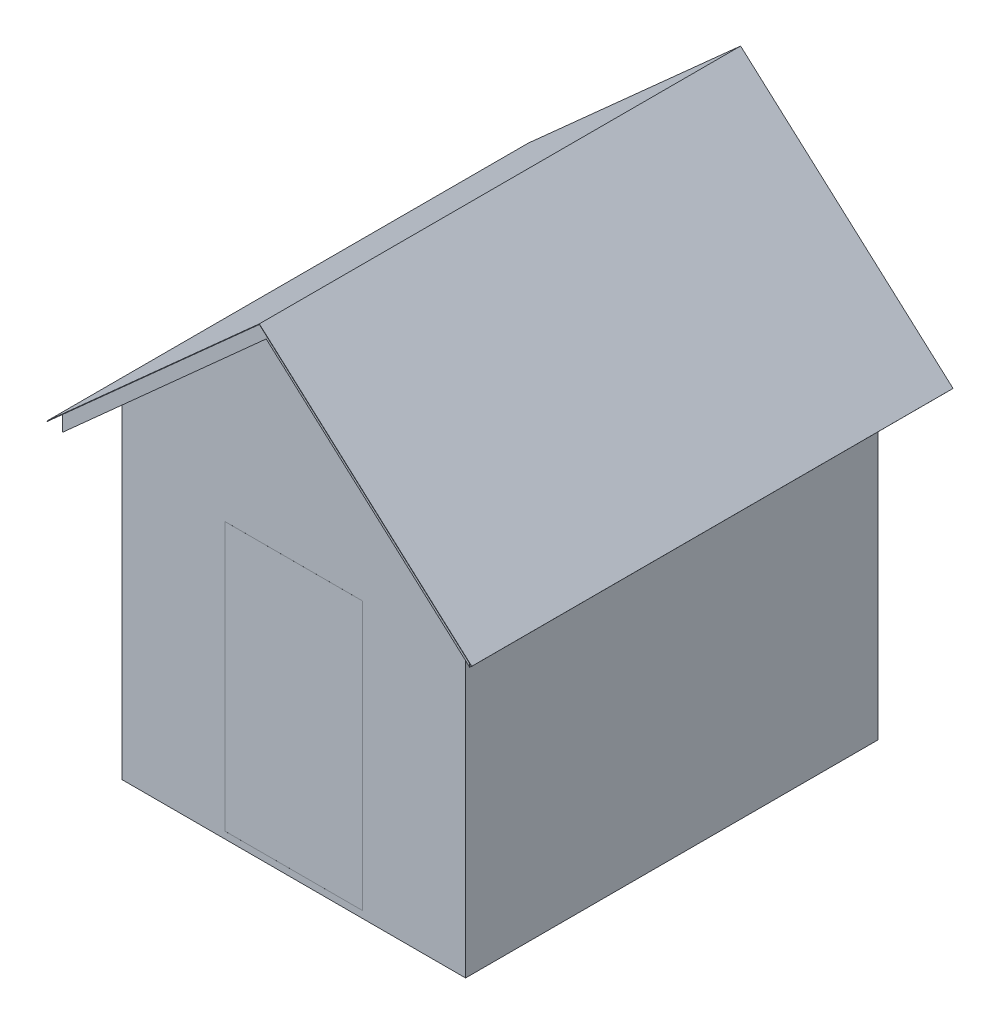
ISO-10303-21;
HEADER;
FILE_DESCRIPTION(('STEP AP214'),'2;1');
FILE_NAME('part.step','',(''),(''),'','','');
FILE_SCHEMA(('AUTOMOTIVE_DESIGN { 1 0 10303 214 1 1 1 1 }'));
ENDSEC;
DATA;
#1=APPLICATION_CONTEXT('core data for automotive mechanical design processes');
#2=APPLICATION_PROTOCOL_DEFINITION('international standard','automotive_design',2000,#1);
#3=PRODUCT_CONTEXT('',#1,'mechanical');
#4=PRODUCT('Part','Part','',(#3));
#5=PRODUCT_RELATED_PRODUCT_CATEGORY('part','',(#4));
#6=PRODUCT_DEFINITION_FORMATION('','',#4);
#7=PRODUCT_DEFINITION_CONTEXT('part definition',#1,'design');
#8=PRODUCT_DEFINITION('design','',#6,#7);
#9=PRODUCT_DEFINITION_SHAPE('','',#8);
#10=(LENGTH_UNIT() NAMED_UNIT(*) SI_UNIT(.MILLI.,.METRE.));
#11=(NAMED_UNIT(*) PLANE_ANGLE_UNIT() SI_UNIT($,.RADIAN.));
#12=(NAMED_UNIT(*) SI_UNIT($,.STERADIAN.) SOLID_ANGLE_UNIT());
#13=UNCERTAINTY_MEASURE_WITH_UNIT(LENGTH_MEASURE(1.E-05),#10,'distance_accuracy_value','');
#14=(GEOMETRIC_REPRESENTATION_CONTEXT(3) GLOBAL_UNCERTAINTY_ASSIGNED_CONTEXT((#13)) GLOBAL_UNIT_ASSIGNED_CONTEXT((#10,
#11,#12)) REPRESENTATION_CONTEXT('',''));
#15=CARTESIAN_POINT('',(0.,0.,0.));
#16=DIRECTION('',(0.,0.,1.));
#17=DIRECTION('',(1.,0.,0.));
#18=AXIS2_PLACEMENT_3D('',#15,#16,#17);
#19=CARTESIAN_POINT('',(-2.00160900286555,3617.74771430914,-1750.));
#20=DIRECTION('',(-0.667203000955183,-0.744875932968973,0.));
#21=DIRECTION('',(0.744875932968973,-0.667203000955183,0.));
#22=AXIS2_PLACEMENT_3D('',#19,#20,#21);
#23=PLANE('',#22);
#24=DIRECTION('',(0.,0.,1.));
#25=VECTOR('',#24,1.);
#26=CARTESIAN_POINT('',(1543.19094316951,2233.68217771199,-1750.));
#27=LINE('',#26,#25);
#28=CARTESIAN_POINT('',(1543.19094316951,2233.68217771199,-1750.));
#29=VERTEX_POINT('',#28);
#30=CARTESIAN_POINT('',(1543.19094316951,2233.68217771199,1750.));
#31=VERTEX_POINT('',#30);
#32=EDGE_CURVE('E59',#29,#31,#27,.T.);
#33=ORIENTED_EDGE('',*,*,#32,.T.);
#34=DIRECTION('',(0.744875932968973,-0.667203000955183,0.));
#35=VECTOR('',#34,1.);
#36=CARTESIAN_POINT('',(-2.00160900286555,3617.74771430914,1750.));
#37=LINE('',#36,#35);
#38=CARTESIAN_POINT('',(0.000422445786859389,3615.95444736169,1750.));
#39=VERTEX_POINT('',#38);
#40=EDGE_CURVE('E108',#39,#31,#37,.T.);
#41=ORIENTED_EDGE('',*,*,#40,.F.);
#42=DIRECTION('',(0.,0.,1.));
#43=VECTOR('',#42,1.);
#44=CARTESIAN_POINT('',(0.000422445786859389,3615.95444736169,-1750.));
#45=LINE('',#44,#43);
#46=CARTESIAN_POINT('',(0.000422445786859389,3615.95444736169,-1750.));
#47=VERTEX_POINT('',#46);
#48=EDGE_CURVE('E12',#47,#39,#45,.T.);
#49=ORIENTED_EDGE('',*,*,#48,.F.);
#50=DIRECTION('',(0.744875932968973,-0.667203000955183,0.));
#51=VECTOR('',#50,1.);
#52=CARTESIAN_POINT('',(-2.00160900286555,3617.74771430914,-1750.));
#53=LINE('',#52,#51);
#54=EDGE_CURVE('E109',#47,#29,#53,.T.);
#55=ORIENTED_EDGE('',*,*,#54,.T.);
#56=EDGE_LOOP('',(#33,#41,#49,#55));
#57=FACE_BOUND('',#56,.T.);
#58=ADVANCED_FACE('F56',(#57),#23,.T.);
#59=CARTESIAN_POINT('',(-1542.53845307509,2233.68259761883,-1750.));
#60=DIRECTION('',(0.667359231519582,-0.744735964020533,0.));
#61=DIRECTION('',(0.744735964020533,0.667359231519582,0.));
#62=AXIS2_PLACEMENT_3D('',#59,#60,#61);
#63=PLANE('',#62);
#64=ORIENTED_EDGE('',*,*,#48,.T.);
#65=DIRECTION('',(0.744735964020533,0.667359231519582,0.));
#66=VECTOR('',#65,1.);
#67=CARTESIAN_POINT('',(-1542.53845307509,2233.68259761883,1750.));
#68=LINE('',#67,#66);
#69=CARTESIAN_POINT('',(-1542.53845307509,2233.68259761883,1750.));
#70=VERTEX_POINT('',#69);
#71=EDGE_CURVE('E123',#70,#39,#68,.T.);
#72=ORIENTED_EDGE('',*,*,#71,.F.);
#73=DIRECTION('',(0.,0.,1.));
#74=VECTOR('',#73,1.);
#75=CARTESIAN_POINT('',(-1542.53845307509,2233.68259761883,-1750.));
#76=LINE('',#75,#74);
#77=CARTESIAN_POINT('',(-1542.53845307509,2233.68259761883,-1750.));
#78=VERTEX_POINT('',#77);
#79=EDGE_CURVE('E64',#78,#70,#76,.T.);
#80=ORIENTED_EDGE('',*,*,#79,.F.);
#81=DIRECTION('',(0.744735964020533,0.667359231519582,0.));
#82=VECTOR('',#81,1.);
#83=CARTESIAN_POINT('',(-1542.53845307509,2233.68259761883,-1750.));
#84=LINE('',#83,#82);
#85=EDGE_CURVE('E114',#78,#47,#84,.T.);
#86=ORIENTED_EDGE('',*,*,#85,.T.);
#87=EDGE_LOOP('',(#64,#72,#80,#86));
#88=FACE_BOUND('',#87,.T.);
#89=ADVANCED_FACE('F164',(#88),#63,.T.);
#90=CARTESIAN_POINT('',(-1542.53845307509,2233.68259761883,-1750.));
#91=DIRECTION('',(0.744735964020489,0.667359231519631,0.));
#92=DIRECTION('',(-0.667359231519631,0.744735964020489,0.));
#93=AXIS2_PLACEMENT_3D('',#90,#91,#92);
#94=PLANE('',#93);
#95=ORIENTED_EDGE('',*,*,#79,.T.);
#96=DIRECTION('',(-0.667359231519631,0.744735964020489,0.));
#97=VECTOR('',#96,1.);
#98=CARTESIAN_POINT('',(-1542.53845307509,2233.68259761883,1750.));
#99=LINE('',#98,#97);
#100=CARTESIAN_POINT('',(-1544.54053076965,2235.91680551089,1750.));
#101=VERTEX_POINT('',#100);
#102=EDGE_CURVE('E134',#70,#101,#99,.T.);
#103=ORIENTED_EDGE('',*,*,#102,.T.);
#104=DIRECTION('',(0.,0.,1.));
#105=VECTOR('',#104,1.);
#106=CARTESIAN_POINT('',(-1544.54053076965,2235.91680551089,-1750.));
#107=LINE('',#106,#105);
#108=CARTESIAN_POINT('',(-1544.54053076965,2235.91680551089,-1750.));
#109=VERTEX_POINT('',#108);
#110=EDGE_CURVE('E149',#109,#101,#107,.T.);
#111=ORIENTED_EDGE('',*,*,#110,.F.);
#112=DIRECTION('',(-0.667359231519631,0.744735964020489,0.));
#113=VECTOR('',#112,1.);
#114=CARTESIAN_POINT('',(-1542.53845307509,2233.68259761883,-1750.));
#115=LINE('',#114,#113);
#116=EDGE_CURVE('E145',#78,#109,#115,.T.);
#117=ORIENTED_EDGE('',*,*,#116,.F.);
#118=EDGE_LOOP('',(#95,#103,#111,#117));
#119=FACE_BOUND('',#118,.T.);
#120=ADVANCED_FACE('F162',(#119),#94,.F.);
#121=CARTESIAN_POINT('',(-1544.54053076965,2235.91680551089,-1750.));
#122=DIRECTION('',(0.667359231519582,-0.744735964020533,0.));
#123=DIRECTION('',(0.744735964020533,0.667359231519582,0.));
#124=AXIS2_PLACEMENT_3D('',#121,#122,#123);
#125=PLANE('',#124);
#126=ORIENTED_EDGE('',*,*,#110,.T.);
#127=DIRECTION('',(0.744735964020533,0.667359231519582,0.));
#128=VECTOR('',#127,1.);
#129=CARTESIAN_POINT('',(-1544.54053076965,2235.91680551089,1750.));
#130=LINE('',#129,#128);
#131=CARTESIAN_POINT('',(0.,3619.98234210805,1750.));
#132=VERTEX_POINT('',#131);
#133=EDGE_CURVE('E129',#101,#132,#130,.T.);
#134=ORIENTED_EDGE('',*,*,#133,.T.);
#135=DIRECTION('',(0.,0.,1.));
#136=VECTOR('',#135,1.);
#137=CARTESIAN_POINT('',(0.,3619.98234210805,-1750.));
#138=LINE('',#137,#136);
#139=CARTESIAN_POINT('',(0.,3619.98234210805,-1750.));
#140=VERTEX_POINT('',#139);
#141=EDGE_CURVE('E151',#140,#132,#138,.T.);
#142=ORIENTED_EDGE('',*,*,#141,.F.);
#143=DIRECTION('',(0.744735964020533,0.667359231519582,0.));
#144=VECTOR('',#143,1.);
#145=CARTESIAN_POINT('',(-1544.54053076965,2235.91680551089,-1750.));
#146=LINE('',#145,#144);
#147=EDGE_CURVE('E143',#109,#140,#146,.T.);
#148=ORIENTED_EDGE('',*,*,#147,.F.);
#149=EDGE_LOOP('',(#126,#134,#142,#148));
#150=FACE_BOUND('',#149,.T.);
#151=ADVANCED_FACE('F159',(#150),#125,.F.);
#152=CARTESIAN_POINT('',(0.,3619.98234210805,-1750.));
#153=DIRECTION('',(-0.667203000955183,-0.744875932968973,0.));
#154=DIRECTION('',(0.744875932968973,-0.667203000955183,0.));
#155=AXIS2_PLACEMENT_3D('',#152,#153,#154);
#156=PLANE('',#155);
#157=ORIENTED_EDGE('',*,*,#141,.T.);
#158=DIRECTION('',(0.744875932968973,-0.667203000955183,0.));
#159=VECTOR('',#158,1.);
#160=CARTESIAN_POINT('',(0.,3619.98234210805,1750.));
#161=LINE('',#160,#159);
#162=CARTESIAN_POINT('',(1545.19255217238,2235.91680551089,1750.));
#163=VERTEX_POINT('',#162);
#164=EDGE_CURVE('E127',#132,#163,#161,.T.);
#165=ORIENTED_EDGE('',*,*,#164,.T.);
#166=DIRECTION('',(0.,0.,1.));
#167=VECTOR('',#166,1.);
#168=CARTESIAN_POINT('',(1545.19255217238,2235.91680551089,-1750.));
#169=LINE('',#168,#167);
#170=CARTESIAN_POINT('',(1545.19255217238,2235.91680551089,-1750.));
#171=VERTEX_POINT('',#170);
#172=EDGE_CURVE('E113',#171,#163,#169,.T.);
#173=ORIENTED_EDGE('',*,*,#172,.F.);
#174=DIRECTION('',(0.744875932968973,-0.667203000955183,0.));
#175=VECTOR('',#174,1.);
#176=CARTESIAN_POINT('',(0.,3619.98234210805,-1750.));
#177=LINE('',#176,#175);
#178=EDGE_CURVE('E141',#140,#171,#177,.T.);
#179=ORIENTED_EDGE('',*,*,#178,.F.);
#180=EDGE_LOOP('',(#157,#165,#173,#179));
#181=FACE_BOUND('',#180,.T.);
#182=ADVANCED_FACE('F155',(#181),#156,.F.);
#183=CARTESIAN_POINT('',(1545.19255217238,2235.91680551089,-1750.));
#184=DIRECTION('',(-0.744875932968931,0.66720300095523,0.));
#185=DIRECTION('',(-0.66720300095523,-0.744875932968931,0.));
#186=AXIS2_PLACEMENT_3D('',#183,#184,#185);
#187=PLANE('',#186);
#188=ORIENTED_EDGE('',*,*,#172,.T.);
#189=DIRECTION('',(-0.66720300095523,-0.744875932968931,0.));
#190=VECTOR('',#189,1.);
#191=CARTESIAN_POINT('',(1545.19255217238,2235.91680551089,1750.));
#192=LINE('',#191,#190);
#193=EDGE_CURVE('E120',#163,#31,#192,.T.);
#194=ORIENTED_EDGE('',*,*,#193,.T.);
#195=ORIENTED_EDGE('',*,*,#32,.F.);
#196=DIRECTION('',(-0.66720300095523,-0.744875932968931,0.));
#197=VECTOR('',#196,1.);
#198=CARTESIAN_POINT('',(1545.19255217238,2235.91680551089,-1750.));
#199=LINE('',#198,#197);
#200=EDGE_CURVE('E139',#171,#29,#199,.T.);
#201=ORIENTED_EDGE('',*,*,#200,.F.);
#202=EDGE_LOOP('',(#188,#194,#195,#201));
#203=FACE_BOUND('',#202,.T.);
#204=ADVANCED_FACE('F125',(#203),#187,.F.);
#205=CARTESIAN_POINT('',(0.,0.,-1750.));
#206=DIRECTION('',(0.,0.,-1.));
#207=DIRECTION('',(-1.,0.,0.));
#208=AXIS2_PLACEMENT_3D('',#205,#206,#207);
#209=PLANE('',#208);
#210=ORIENTED_EDGE('',*,*,#54,.F.);
#211=ORIENTED_EDGE('',*,*,#85,.F.);
#212=ORIENTED_EDGE('',*,*,#116,.T.);
#213=ORIENTED_EDGE('',*,*,#147,.T.);
#214=ORIENTED_EDGE('',*,*,#178,.T.);
#215=ORIENTED_EDGE('',*,*,#200,.T.);
#216=EDGE_LOOP('',(#210,#211,#212,#213,#214,#215));
#217=FACE_BOUND('',#216,.T.);
#218=ADVANCED_FACE('F166',(#217),#209,.T.);
#219=CARTESIAN_POINT('',(0.,0.,1750.));
#220=DIRECTION('',(0.,0.,-1.));
#221=DIRECTION('',(-1.,0.,0.));
#222=AXIS2_PLACEMENT_3D('',#219,#220,#221);
#223=PLANE('',#222);
#224=ORIENTED_EDGE('',*,*,#40,.T.);
#225=ORIENTED_EDGE('',*,*,#193,.F.);
#226=ORIENTED_EDGE('',*,*,#164,.F.);
#227=ORIENTED_EDGE('',*,*,#133,.F.);
#228=ORIENTED_EDGE('',*,*,#102,.F.);
#229=ORIENTED_EDGE('',*,*,#71,.T.);
#230=EDGE_LOOP('',(#224,#225,#226,#227,#228,#229));
#231=FACE_BOUND('',#230,.T.);
#232=ADVANCED_FACE('F118',(#231),#223,.F.);
#233=CLOSED_SHELL('',(#58,#89,#120,#151,#182,#204,#218,#232));
#234=MANIFOLD_SOLID_BREP('B2',#233);
#235=CARTESIAN_POINT('',(-4.66293670342566E-12,3500.,1700.));
#236=DIRECTION('',(0.667776317014636,-0.744362002277365,0.));
#237=DIRECTION('',(0.744362002277365,0.667776317014636,0.));
#238=AXIS2_PLACEMENT_3D('',#235,#236,#237);
#239=PLANE('',#238);
#240=DIRECTION('',(0.,0.,-1.));
#241=VECTOR('',#240,1.);
#242=CARTESIAN_POINT('',(-1480.23127503153,2172.06629819061,1700.));
#243=LINE('',#242,#241);
#244=CARTESIAN_POINT('',(-1480.23127503153,2172.06629819061,1700.));
#245=VERTEX_POINT('',#244);
#246=CARTESIAN_POINT('',(-1480.23127503153,2172.06629819061,-1700.));
#247=VERTEX_POINT('',#246);
#248=EDGE_CURVE('E261',#245,#247,#243,.T.);
#249=ORIENTED_EDGE('',*,*,#248,.T.);
#250=DIRECTION('',(-0.744362002277365,-0.667776317014636,0.));
#251=VECTOR('',#250,1.);
#252=CARTESIAN_POINT('',(-4.66293670342566E-12,3500.,-1700.));
#253=LINE('',#252,#251);
#254=CARTESIAN_POINT('',(-4.66293670342566E-12,3500.,-1700.));
#255=VERTEX_POINT('',#254);
#256=EDGE_CURVE('E310',#255,#247,#253,.T.);
#257=ORIENTED_EDGE('',*,*,#256,.F.);
#258=DIRECTION('',(0.,0.,-1.));
#259=VECTOR('',#258,1.);
#260=CARTESIAN_POINT('',(-4.66293670342566E-12,3500.,1700.));
#261=LINE('',#260,#259);
#262=CARTESIAN_POINT('',(-4.66293670342566E-12,3500.,1700.));
#263=VERTEX_POINT('',#262);
#264=EDGE_CURVE('E54',#263,#255,#261,.T.);
#265=ORIENTED_EDGE('',*,*,#264,.F.);
#266=DIRECTION('',(-0.744362002277365,-0.667776317014636,0.));
#267=VECTOR('',#266,1.);
#268=CARTESIAN_POINT('',(-4.66293670342566E-12,3500.,1700.));
#269=LINE('',#268,#267);
#270=EDGE_CURVE('E311',#263,#245,#269,.T.);
#271=ORIENTED_EDGE('',*,*,#270,.T.);
#272=EDGE_LOOP('',(#249,#257,#265,#271));
#273=FACE_BOUND('',#272,.T.);
#274=ADVANCED_FACE('F258',(#273),#239,.T.);
#275=CARTESIAN_POINT('',(-4.66293670342566E-12,3500.,1700.));
#276=DIRECTION('',(-0.667776317014634,-0.744362002277367,0.));
#277=DIRECTION('',(0.744362002277367,-0.667776317014634,0.));
#278=AXIS2_PLACEMENT_3D('',#275,#276,#277);
#279=PLANE('',#278);
#280=ORIENTED_EDGE('',*,*,#264,.T.);
#281=DIRECTION('',(-0.744362002277367,0.667776317014634,0.));
#282=VECTOR('',#281,1.);
#283=CARTESIAN_POINT('',(-4.66293670342566E-12,3500.,-1700.));
#284=LINE('',#283,#282);
#285=CARTESIAN_POINT('',(1480.23127503153,2172.06629819061,-1700.));
#286=VERTEX_POINT('',#285);
#287=EDGE_CURVE('E328',#286,#255,#284,.T.);
#288=ORIENTED_EDGE('',*,*,#287,.F.);
#289=DIRECTION('',(0.,0.,-1.));
#290=VECTOR('',#289,1.);
#291=CARTESIAN_POINT('',(1480.23127503153,2172.06629819061,1700.));
#292=LINE('',#291,#290);
#293=CARTESIAN_POINT('',(1480.23127503153,2172.06629819061,1700.));
#294=VERTEX_POINT('',#293);
#295=EDGE_CURVE('E266',#294,#286,#292,.T.);
#296=ORIENTED_EDGE('',*,*,#295,.F.);
#297=DIRECTION('',(-0.744362002277367,0.667776317014634,0.));
#298=VECTOR('',#297,1.);
#299=CARTESIAN_POINT('',(-4.66293670342566E-12,3500.,1700.));
#300=LINE('',#299,#298);
#301=EDGE_CURVE('E316',#294,#263,#300,.T.);
#302=ORIENTED_EDGE('',*,*,#301,.T.);
#303=EDGE_LOOP('',(#280,#288,#296,#302));
#304=FACE_BOUND('',#303,.T.);
#305=ADVANCED_FACE('F368',(#304),#279,.T.);
#306=CARTESIAN_POINT('',(1480.23127503153,2172.06629819061,1700.));
#307=DIRECTION('',(1.,0.,0.));
#308=DIRECTION('',(0.,0.,-1.));
#309=AXIS2_PLACEMENT_3D('',#306,#307,#308);
#310=PLANE('',#309);
#311=ORIENTED_EDGE('',*,*,#295,.T.);
#312=DIRECTION('',(0.,-1.,0.));
#313=VECTOR('',#312,1.);
#314=CARTESIAN_POINT('',(1480.23127503153,2172.06629819061,-1700.));
#315=LINE('',#314,#313);
#316=CARTESIAN_POINT('',(1480.23127503153,2292.04864029866,-1700.));
#317=VERTEX_POINT('',#316);
#318=EDGE_CURVE('E335',#317,#286,#315,.T.);
#319=ORIENTED_EDGE('',*,*,#318,.F.);
#320=DIRECTION('',(0.,0.,-1.));
#321=VECTOR('',#320,1.);
#322=CARTESIAN_POINT('',(1480.23127503153,2292.04864029866,1700.));
#323=LINE('',#322,#321);
#324=CARTESIAN_POINT('',(1480.23127503153,2292.04864029866,1700.));
#325=VERTEX_POINT('',#324);
#326=EDGE_CURVE('E351',#325,#317,#323,.T.);
#327=ORIENTED_EDGE('',*,*,#326,.F.);
#328=DIRECTION('',(0.,-1.,0.));
#329=VECTOR('',#328,1.);
#330=CARTESIAN_POINT('',(1480.23127503153,2172.06629819061,1700.));
#331=LINE('',#330,#329);
#332=EDGE_CURVE('E347',#325,#294,#331,.T.);
#333=ORIENTED_EDGE('',*,*,#332,.T.);
#334=EDGE_LOOP('',(#311,#319,#327,#333));
#335=FACE_BOUND('',#334,.T.);
#336=ADVANCED_FACE('F364',(#335),#310,.T.);
#337=CARTESIAN_POINT('',(1480.23127503153,2292.04864029866,1700.));
#338=DIRECTION('',(0.667776317014634,0.744362002277367,0.));
#339=DIRECTION('',(-0.744362002277367,0.667776317014634,0.));
#340=AXIS2_PLACEMENT_3D('',#337,#338,#339);
#341=PLANE('',#340);
#342=ORIENTED_EDGE('',*,*,#326,.T.);
#343=DIRECTION('',(0.744362002277367,-0.667776317014634,0.));
#344=VECTOR('',#343,1.);
#345=CARTESIAN_POINT('',(1480.23127503153,2292.04864029866,-1700.));
#346=LINE('',#345,#344);
#347=CARTESIAN_POINT('',(0.,3619.98234210805,-1700.));
#348=VERTEX_POINT('',#347);
#349=EDGE_CURVE('E332',#348,#317,#346,.T.);
#350=ORIENTED_EDGE('',*,*,#349,.F.);
#351=DIRECTION('',(0.,0.,-1.));
#352=VECTOR('',#351,1.);
#353=CARTESIAN_POINT('',(0.,3619.98234210805,1700.));
#354=LINE('',#353,#352);
#355=CARTESIAN_POINT('',(0.,3619.98234210805,1700.));
#356=VERTEX_POINT('',#355);
#357=EDGE_CURVE('E353',#356,#348,#354,.T.);
#358=ORIENTED_EDGE('',*,*,#357,.F.);
#359=DIRECTION('',(0.744362002277367,-0.667776317014634,0.));
#360=VECTOR('',#359,1.);
#361=CARTESIAN_POINT('',(1480.23127503153,2292.04864029866,1700.));
#362=LINE('',#361,#360);
#363=EDGE_CURVE('E344',#356,#325,#362,.T.);
#364=ORIENTED_EDGE('',*,*,#363,.T.);
#365=EDGE_LOOP('',(#342,#350,#358,#364));
#366=FACE_BOUND('',#365,.T.);
#367=ADVANCED_FACE('F361',(#366),#341,.T.);
#368=CARTESIAN_POINT('',(-1480.23127503153,2292.04864029866,1700.));
#369=DIRECTION('',(-0.667776317014634,0.744362002277367,0.));
#370=DIRECTION('',(-0.744362002277367,-0.667776317014634,0.));
#371=AXIS2_PLACEMENT_3D('',#368,#369,#370);
#372=PLANE('',#371);
#373=ORIENTED_EDGE('',*,*,#357,.T.);
#374=DIRECTION('',(0.744362002277367,0.667776317014634,0.));
#375=VECTOR('',#374,1.);
#376=CARTESIAN_POINT('',(-1480.23127503153,2292.04864029866,-1700.));
#377=LINE('',#376,#375);
#378=CARTESIAN_POINT('',(-1480.23127503153,2292.04864029866,-1700.));
#379=VERTEX_POINT('',#378);
#380=EDGE_CURVE('E323',#379,#348,#377,.T.);
#381=ORIENTED_EDGE('',*,*,#380,.F.);
#382=DIRECTION('',(0.,0.,-1.));
#383=VECTOR('',#382,1.);
#384=CARTESIAN_POINT('',(-1480.23127503153,2292.04864029866,1700.));
#385=LINE('',#384,#383);
#386=CARTESIAN_POINT('',(-1480.23127503153,2292.04864029866,1700.));
#387=VERTEX_POINT('',#386);
#388=EDGE_CURVE('E315',#387,#379,#385,.T.);
#389=ORIENTED_EDGE('',*,*,#388,.F.);
#390=DIRECTION('',(0.744362002277367,0.667776317014634,0.));
#391=VECTOR('',#390,1.);
#392=CARTESIAN_POINT('',(-1480.23127503153,2292.04864029866,1700.));
#393=LINE('',#392,#391);
#394=EDGE_CURVE('E341',#387,#356,#393,.T.);
#395=ORIENTED_EDGE('',*,*,#394,.T.);
#396=EDGE_LOOP('',(#373,#381,#389,#395));
#397=FACE_BOUND('',#396,.T.);
#398=ADVANCED_FACE('F355',(#397),#372,.T.);
#399=CARTESIAN_POINT('',(-1480.23127503153,2172.06629819061,1700.));
#400=DIRECTION('',(-1.,0.,0.));
#401=DIRECTION('',(0.,0.,1.));
#402=AXIS2_PLACEMENT_3D('',#399,#400,#401);
#403=PLANE('',#402);
#404=ORIENTED_EDGE('',*,*,#388,.T.);
#405=DIRECTION('',(0.,1.,0.));
#406=VECTOR('',#405,1.);
#407=CARTESIAN_POINT('',(-1480.23127503153,2172.06629819061,-1700.));
#408=LINE('',#407,#406);
#409=EDGE_CURVE('E318',#247,#379,#408,.T.);
#410=ORIENTED_EDGE('',*,*,#409,.F.);
#411=ORIENTED_EDGE('',*,*,#248,.F.);
#412=DIRECTION('',(0.,1.,0.));
#413=VECTOR('',#412,1.);
#414=CARTESIAN_POINT('',(-1480.23127503153,2172.06629819061,1700.));
#415=LINE('',#414,#413);
#416=EDGE_CURVE('E339',#245,#387,#415,.T.);
#417=ORIENTED_EDGE('',*,*,#416,.T.);
#418=EDGE_LOOP('',(#404,#410,#411,#417));
#419=FACE_BOUND('',#418,.T.);
#420=ADVANCED_FACE('F319',(#419),#403,.T.);
#421=CARTESIAN_POINT('',(0.,0.,1700.));
#422=DIRECTION('',(0.,0.,-1.));
#423=DIRECTION('',(-1.,0.,0.));
#424=AXIS2_PLACEMENT_3D('',#421,#422,#423);
#425=PLANE('',#424);
#426=ORIENTED_EDGE('',*,*,#270,.F.);
#427=ORIENTED_EDGE('',*,*,#301,.F.);
#428=ORIENTED_EDGE('',*,*,#332,.F.);
#429=ORIENTED_EDGE('',*,*,#363,.F.);
#430=ORIENTED_EDGE('',*,*,#394,.F.);
#431=ORIENTED_EDGE('',*,*,#416,.F.);
#432=EDGE_LOOP('',(#426,#427,#428,#429,#430,#431));
#433=FACE_BOUND('',#432,.T.);
#434=ADVANCED_FACE('F367',(#433),#425,.F.);
#435=CARTESIAN_POINT('',(0.,0.,-1700.));
#436=DIRECTION('',(0.,0.,-1.));
#437=DIRECTION('',(-1.,0.,0.));
#438=AXIS2_PLACEMENT_3D('',#435,#436,#437);
#439=PLANE('',#438);
#440=ORIENTED_EDGE('',*,*,#256,.T.);
#441=ORIENTED_EDGE('',*,*,#409,.T.);
#442=ORIENTED_EDGE('',*,*,#380,.T.);
#443=ORIENTED_EDGE('',*,*,#349,.T.);
#444=ORIENTED_EDGE('',*,*,#318,.T.);
#445=ORIENTED_EDGE('',*,*,#287,.T.);
#446=EDGE_LOOP('',(#440,#441,#442,#443,#444,#445));
#447=FACE_BOUND('',#446,.T.);
#448=ADVANCED_FACE('F326',(#447),#439,.T.);
#449=CLOSED_SHELL('',(#274,#305,#336,#367,#398,#420,#434,#448));
#450=MANIFOLD_SOLID_BREP('B6',#449);
#451=CARTESIAN_POINT('',(-1250.,3500.,1400.));
#452=DIRECTION('',(0.,0.,-1.));
#453=DIRECTION('',(-1.,0.,0.));
#454=AXIS2_PLACEMENT_3D('',#451,#452,#453);
#455=PLANE('',#454);
#456=DIRECTION('',(0.,-1.,0.));
#457=VECTOR('',#456,1.);
#458=CARTESIAN_POINT('',(-499.8742254522,1999.88118404703,1400.));
#459=LINE('',#458,#457);
#460=CARTESIAN_POINT('',(-499.8742254522,1999.88118404703,1400.));
#461=VERTEX_POINT('',#460);
#462=CARTESIAN_POINT('',(-499.8742254522,50.0502908829536,1400.));
#463=VERTEX_POINT('',#462);
#464=EDGE_CURVE('E469',#461,#463,#459,.T.);
#465=ORIENTED_EDGE('',*,*,#464,.F.);
#466=DIRECTION('',(-1.,0.,0.));
#467=VECTOR('',#466,1.);
#468=CARTESIAN_POINT('',(-499.8742254522,1999.88118404703,1400.));
#469=LINE('',#468,#467);
#470=CARTESIAN_POINT('',(499.876060579969,1999.88118404703,1400.));
#471=VERTEX_POINT('',#470);
#472=EDGE_CURVE('E492',#471,#461,#469,.T.);
#473=ORIENTED_EDGE('',*,*,#472,.F.);
#474=DIRECTION('',(0.,1.,0.));
#475=VECTOR('',#474,1.);
#476=CARTESIAN_POINT('',(499.876060579969,1999.88118404703,1400.));
#477=LINE('',#476,#475);
#478=CARTESIAN_POINT('',(499.876060579969,50.0502908829536,1400.));
#479=VERTEX_POINT('',#478);
#480=EDGE_CURVE('E497',#479,#471,#477,.T.);
#481=ORIENTED_EDGE('',*,*,#480,.F.);
#482=DIRECTION('',(1.,0.,0.));
#483=VECTOR('',#482,1.);
#484=CARTESIAN_POINT('',(-499.8742254522,50.0502908829536,1400.));
#485=LINE('',#484,#483);
#486=EDGE_CURVE('E512',#463,#479,#485,.T.);
#487=ORIENTED_EDGE('',*,*,#486,.F.);
#488=EDGE_LOOP('',(#465,#473,#481,#487));
#489=FACE_BOUND('',#488,.T.);
#490=ADVANCED_FACE('F461',(#489),#455,.T.);
#491=CARTESIAN_POINT('',(0.,0.,1500.));
#492=DIRECTION('',(0.,0.,1.));
#493=DIRECTION('',(1.,0.,0.));
#494=AXIS2_PLACEMENT_3D('',#491,#492,#493);
#495=PLANE('',#494);
#496=DIRECTION('',(0.,-1.,0.));
#497=VECTOR('',#496,1.);
#498=CARTESIAN_POINT('',(-499.8742254522,1999.88118404703,1500.));
#499=LINE('',#498,#497);
#500=CARTESIAN_POINT('',(-499.8742254522,1999.88118404703,1500.));
#501=VERTEX_POINT('',#500);
#502=CARTESIAN_POINT('',(-499.8742254522,50.0502908829536,1500.));
#503=VERTEX_POINT('',#502);
#504=EDGE_CURVE('E521',#501,#503,#499,.T.);
#505=ORIENTED_EDGE('',*,*,#504,.T.);
#506=DIRECTION('',(1.,0.,0.));
#507=VECTOR('',#506,1.);
#508=CARTESIAN_POINT('',(-499.8742254522,50.0502908829536,1500.));
#509=LINE('',#508,#507);
#510=CARTESIAN_POINT('',(499.876060579969,50.0502908829536,1500.));
#511=VERTEX_POINT('',#510);
#512=EDGE_CURVE('E510',#503,#511,#509,.T.);
#513=ORIENTED_EDGE('',*,*,#512,.T.);
#514=DIRECTION('',(0.,1.,0.));
#515=VECTOR('',#514,1.);
#516=CARTESIAN_POINT('',(499.876060579969,1999.88118404703,1500.));
#517=LINE('',#516,#515);
#518=CARTESIAN_POINT('',(499.876060579969,1999.88118404703,1500.));
#519=VERTEX_POINT('',#518);
#520=EDGE_CURVE('E513',#511,#519,#517,.T.);
#521=ORIENTED_EDGE('',*,*,#520,.T.);
#522=DIRECTION('',(-1.,0.,0.));
#523=VECTOR('',#522,1.);
#524=CARTESIAN_POINT('',(-499.8742254522,1999.88118404703,1500.));
#525=LINE('',#524,#523);
#526=EDGE_CURVE('E518',#519,#501,#525,.T.);
#527=ORIENTED_EDGE('',*,*,#526,.T.);
#528=EDGE_LOOP('',(#505,#513,#521,#527));
#529=FACE_BOUND('',#528,.T.);
#530=ADVANCED_FACE('F520',(#529),#495,.T.);
#531=CARTESIAN_POINT('',(-499.8742254522,50.0502908829536,-791.196282024595));
#532=DIRECTION('',(0.,-1.,0.));
#533=DIRECTION('',(0.,0.,-1.));
#534=AXIS2_PLACEMENT_3D('',#531,#532,#533);
#535=PLANE('',#534);
#536=DIRECTION('',(0.,0.,1.));
#537=VECTOR('',#536,1.);
#538=CARTESIAN_POINT('',(-499.8742254522,50.0502908829536,-791.196282024595));
#539=LINE('',#538,#537);
#540=EDGE_CURVE('E256',#463,#503,#539,.T.);
#541=ORIENTED_EDGE('',*,*,#540,.F.);
#542=ORIENTED_EDGE('',*,*,#486,.T.);
#543=DIRECTION('',(0.,0.,1.));
#544=VECTOR('',#543,1.);
#545=CARTESIAN_POINT('',(499.876060579969,50.0502908829536,-791.196282024595));
#546=LINE('',#545,#544);
#547=EDGE_CURVE('E507',#479,#511,#546,.T.);
#548=ORIENTED_EDGE('',*,*,#547,.T.);
#549=ORIENTED_EDGE('',*,*,#512,.F.);
#550=EDGE_LOOP('',(#541,#542,#548,#549));
#551=FACE_BOUND('',#550,.T.);
#552=ADVANCED_FACE('F508',(#551),#535,.T.);
#553=CARTESIAN_POINT('',(499.876060579969,1999.88118404703,-791.196282024595));
#554=DIRECTION('',(1.,0.,0.));
#555=DIRECTION('',(0.,0.,-1.));
#556=AXIS2_PLACEMENT_3D('',#553,#554,#555);
#557=PLANE('',#556);
#558=ORIENTED_EDGE('',*,*,#547,.F.);
#559=ORIENTED_EDGE('',*,*,#480,.T.);
#560=DIRECTION('',(0.,0.,1.));
#561=VECTOR('',#560,1.);
#562=CARTESIAN_POINT('',(499.876060579969,1999.88118404703,-791.196282024595));
#563=LINE('',#562,#561);
#564=EDGE_CURVE('E502',#471,#519,#563,.T.);
#565=ORIENTED_EDGE('',*,*,#564,.T.);
#566=ORIENTED_EDGE('',*,*,#520,.F.);
#567=EDGE_LOOP('',(#558,#559,#565,#566));
#568=FACE_BOUND('',#567,.T.);
#569=ADVANCED_FACE('F514',(#568),#557,.T.);
#570=CARTESIAN_POINT('',(-499.8742254522,1999.88118404703,-791.196282024595));
#571=DIRECTION('',(0.,1.,0.));
#572=DIRECTION('',(0.,0.,1.));
#573=AXIS2_PLACEMENT_3D('',#570,#571,#572);
#574=PLANE('',#573);
#575=ORIENTED_EDGE('',*,*,#564,.F.);
#576=ORIENTED_EDGE('',*,*,#472,.T.);
#577=DIRECTION('',(0.,0.,1.));
#578=VECTOR('',#577,1.);
#579=CARTESIAN_POINT('',(-499.8742254522,1999.88118404703,-791.196282024595));
#580=LINE('',#579,#578);
#581=EDGE_CURVE('E528',#461,#501,#580,.T.);
#582=ORIENTED_EDGE('',*,*,#581,.T.);
#583=ORIENTED_EDGE('',*,*,#526,.F.);
#584=EDGE_LOOP('',(#575,#576,#582,#583));
#585=FACE_BOUND('',#584,.T.);
#586=ADVANCED_FACE('F534',(#585),#574,.T.);
#587=CARTESIAN_POINT('',(-499.8742254522,1999.88118404703,-791.196282024595));
#588=DIRECTION('',(-1.,0.,0.));
#589=DIRECTION('',(0.,0.,1.));
#590=AXIS2_PLACEMENT_3D('',#587,#588,#589);
#591=PLANE('',#590);
#592=ORIENTED_EDGE('',*,*,#581,.F.);
#593=ORIENTED_EDGE('',*,*,#464,.T.);
#594=ORIENTED_EDGE('',*,*,#540,.T.);
#595=ORIENTED_EDGE('',*,*,#504,.F.);
#596=EDGE_LOOP('',(#592,#593,#594,#595));
#597=FACE_BOUND('',#596,.T.);
#598=ADVANCED_FACE('F535',(#597),#591,.T.);
#599=CLOSED_SHELL('',(#490,#530,#552,#569,#586,#598));
#600=MANIFOLD_SOLID_BREP('B48',#599);
#601=CARTESIAN_POINT('',(-1250.,3500.,1500.));
#602=DIRECTION('',(0.,0.,-1.));
#603=DIRECTION('',(-1.,0.,0.));
#604=AXIS2_PLACEMENT_3D('',#601,#602,#603);
#605=PLANE('',#604);
#606=DIRECTION('',(0.,-1.,0.));
#607=VECTOR('',#606,1.);
#608=CARTESIAN_POINT('',(1250.,3500.,1500.));
#609=LINE('',#608,#607);
#610=CARTESIAN_POINT('',(1250.,2378.60960968658,1500.));
#611=VERTEX_POINT('',#610);
#612=CARTESIAN_POINT('',(1250.,0.,1500.));
#613=VERTEX_POINT('',#612);
#614=EDGE_CURVE('E858',#611,#613,#609,.T.);
#615=ORIENTED_EDGE('',*,*,#614,.F.);
#616=DIRECTION('',(0.744362002277367,-0.667776317014634,0.));
#617=VECTOR('',#616,1.);
#618=CARTESIAN_POINT('',(1250.,2378.60960968658,1500.));
#619=LINE('',#618,#617);
#620=CARTESIAN_POINT('',(-4.66293670342566E-12,3500.,1500.));
#621=VERTEX_POINT('',#620);
#622=EDGE_CURVE('E768',#621,#611,#619,.T.);
#623=ORIENTED_EDGE('',*,*,#622,.F.);
#624=DIRECTION('',(0.744362002277367,0.667776317014634,0.));
#625=VECTOR('',#624,1.);
#626=CARTESIAN_POINT('',(-4.66293670342566E-12,3500.,1500.));
#627=LINE('',#626,#625);
#628=CARTESIAN_POINT('',(-1250.,2378.60960968658,1500.));
#629=VERTEX_POINT('',#628);
#630=EDGE_CURVE('E818',#629,#621,#627,.T.);
#631=ORIENTED_EDGE('',*,*,#630,.F.);
#632=DIRECTION('',(0.,-1.,0.));
#633=VECTOR('',#632,1.);
#634=CARTESIAN_POINT('',(-1250.,3500.,1500.));
#635=LINE('',#634,#633);
#636=CARTESIAN_POINT('',(-1250.,0.,1500.));
#637=VERTEX_POINT('',#636);
#638=EDGE_CURVE('E861',#629,#637,#635,.T.);
#639=ORIENTED_EDGE('',*,*,#638,.T.);
#640=DIRECTION('',(1.,0.,0.));
#641=VECTOR('',#640,1.);
#642=CARTESIAN_POINT('',(-1250.,0.,1500.));
#643=LINE('',#642,#641);
#644=EDGE_CURVE('E854',#637,#613,#643,.T.);
#645=ORIENTED_EDGE('',*,*,#644,.T.);
#646=EDGE_LOOP('',(#615,#623,#631,#639,#645));
#647=FACE_BOUND('',#646,.T.);
#648=DIRECTION('',(0.,1.,0.));
#649=VECTOR('',#648,1.);
#650=CARTESIAN_POINT('',(-500.,50.,1500.));
#651=LINE('',#650,#649);
#652=CARTESIAN_POINT('',(-500.,49.9999999999998,1500.));
#653=VERTEX_POINT('',#652);
#654=CARTESIAN_POINT('',(-500.,2000.,1500.));
#655=VERTEX_POINT('',#654);
#656=EDGE_CURVE('E613',#653,#655,#651,.T.);
#657=ORIENTED_EDGE('',*,*,#656,.T.);
#658=DIRECTION('',(1.,0.,0.));
#659=VECTOR('',#658,1.);
#660=CARTESIAN_POINT('',(-500.,2000.,1500.));
#661=LINE('',#660,#659);
#662=CARTESIAN_POINT('',(500.,2000.,1500.));
#663=VERTEX_POINT('',#662);
#664=EDGE_CURVE('E742',#655,#663,#661,.T.);
#665=ORIENTED_EDGE('',*,*,#664,.T.);
#666=DIRECTION('',(0.,-1.,0.));
#667=VECTOR('',#666,1.);
#668=CARTESIAN_POINT('',(500.,2000.,1500.));
#669=LINE('',#668,#667);
#670=CARTESIAN_POINT('',(500.,50.,1500.));
#671=VERTEX_POINT('',#670);
#672=EDGE_CURVE('E746',#663,#671,#669,.T.);
#673=ORIENTED_EDGE('',*,*,#672,.T.);
#674=DIRECTION('',(1.,0.,0.));
#675=VECTOR('',#674,1.);
#676=CARTESIAN_POINT('',(-500.,50.,1500.));
#677=LINE('',#676,#675);
#678=EDGE_CURVE('E725',#653,#671,#677,.T.);
#679=ORIENTED_EDGE('',*,*,#678,.F.);
#680=EDGE_LOOP('',(#657,#665,#673,#679));
#681=FACE_BOUND('',#680,.T.);
#682=ADVANCED_FACE('F597',(#647,#681),#605,.F.);
#683=CARTESIAN_POINT('',(-1250.,3500.,1400.));
#684=DIRECTION('',(0.,0.,-1.));
#685=DIRECTION('',(-1.,0.,0.));
#686=AXIS2_PLACEMENT_3D('',#683,#684,#685);
#687=PLANE('',#686);
#688=DIRECTION('',(-1.,0.,0.));
#689=VECTOR('',#688,1.);
#690=CARTESIAN_POINT('',(-1250.,2000.,1400.));
#691=LINE('',#690,#689);
#692=CARTESIAN_POINT('',(500.,2000.,1400.));
#693=VERTEX_POINT('',#692);
#694=CARTESIAN_POINT('',(-500.,2000.,1400.));
#695=VERTEX_POINT('',#694);
#696=EDGE_CURVE('E459',#693,#695,#691,.T.);
#697=ORIENTED_EDGE('',*,*,#696,.T.);
#698=DIRECTION('',(0.,-1.,0.));
#699=VECTOR('',#698,1.);
#700=CARTESIAN_POINT('',(-500.,3500.,1400.));
#701=LINE('',#700,#699);
#702=CARTESIAN_POINT('',(-500.,100.,1400.));
#703=VERTEX_POINT('',#702);
#704=EDGE_CURVE('E760',#695,#703,#701,.T.);
#705=ORIENTED_EDGE('',*,*,#704,.T.);
#706=DIRECTION('',(1.,0.,0.));
#707=VECTOR('',#706,1.);
#708=CARTESIAN_POINT('',(0.,100.,1400.));
#709=LINE('',#708,#707);
#710=CARTESIAN_POINT('',(-1150.,100.,1400.));
#711=VERTEX_POINT('',#710);
#712=EDGE_CURVE('E775',#711,#703,#709,.T.);
#713=ORIENTED_EDGE('',*,*,#712,.F.);
#714=DIRECTION('',(0.,-1.,0.));
#715=VECTOR('',#714,1.);
#716=CARTESIAN_POINT('',(-1150.,3500.,1400.));
#717=LINE('',#716,#715);
#718=CARTESIAN_POINT('',(-1150.,2468.32084091166,1400.));
#719=VERTEX_POINT('',#718);
#720=EDGE_CURVE('E774',#719,#711,#717,.T.);
#721=ORIENTED_EDGE('',*,*,#720,.F.);
#722=DIRECTION('',(0.744362002277367,0.667776317014634,0.));
#723=VECTOR('',#722,1.);
#724=CARTESIAN_POINT('',(-4.66293670342566E-12,3500.,1400.));
#725=LINE('',#724,#723);
#726=CARTESIAN_POINT('',(-4.66293670342566E-12,3500.,1400.));
#727=VERTEX_POINT('',#726);
#728=EDGE_CURVE('E802',#719,#727,#725,.T.);
#729=ORIENTED_EDGE('',*,*,#728,.T.);
#730=DIRECTION('',(0.744362002277367,-0.667776317014634,0.));
#731=VECTOR('',#730,1.);
#732=CARTESIAN_POINT('',(1250.,2378.60960968658,1400.));
#733=LINE('',#732,#731);
#734=CARTESIAN_POINT('',(1150.,2468.32084091166,1400.));
#735=VERTEX_POINT('',#734);
#736=EDGE_CURVE('E764',#727,#735,#733,.T.);
#737=ORIENTED_EDGE('',*,*,#736,.T.);
#738=DIRECTION('',(0.,-1.,0.));
#739=VECTOR('',#738,1.);
#740=CARTESIAN_POINT('',(1150.,3500.,1400.));
#741=LINE('',#740,#739);
#742=CARTESIAN_POINT('',(1150.,100.,1400.));
#743=VERTEX_POINT('',#742);
#744=EDGE_CURVE('E770',#735,#743,#741,.T.);
#745=ORIENTED_EDGE('',*,*,#744,.T.);
#746=CARTESIAN_POINT('',(500.,100.,1400.));
#747=VERTEX_POINT('',#746);
#748=EDGE_CURVE('E793',#747,#743,#709,.T.);
#749=ORIENTED_EDGE('',*,*,#748,.F.);
#750=DIRECTION('',(0.,1.,0.));
#751=VECTOR('',#750,1.);
#752=CARTESIAN_POINT('',(500.,3500.,1400.));
#753=LINE('',#752,#751);
#754=EDGE_CURVE('E756',#747,#693,#753,.T.);
#755=ORIENTED_EDGE('',*,*,#754,.T.);
#756=EDGE_LOOP('',(#697,#705,#713,#721,#729,#737,#745,#749,#755));
#757=FACE_BOUND('',#756,.T.);
#758=ADVANCED_FACE('F881',(#757),#687,.T.);
#759=CARTESIAN_POINT('',(0.,100.,0.));
#760=DIRECTION('',(0.,-1.,0.));
#761=DIRECTION('',(0.,0.,-1.));
#762=AXIS2_PLACEMENT_3D('',#759,#760,#761);
#763=PLANE('',#762);
#764=DIRECTION('',(0.,0.,1.));
#765=VECTOR('',#764,1.);
#766=CARTESIAN_POINT('',(-500.,100.,0.));
#767=LINE('',#766,#765);
#768=CARTESIAN_POINT('',(-500.,100.,1004.));
#769=VERTEX_POINT('',#768);
#770=EDGE_CURVE('E606',#769,#703,#767,.T.);
#771=ORIENTED_EDGE('',*,*,#770,.F.);
#772=DIRECTION('',(1.,0.,0.));
#773=VECTOR('',#772,1.);
#774=CARTESIAN_POINT('',(0.,100.,1004.));
#775=LINE('',#774,#773);
#776=CARTESIAN_POINT('',(500.,100.,1004.));
#777=VERTEX_POINT('',#776);
#778=EDGE_CURVE('E870',#769,#777,#775,.T.);
#779=ORIENTED_EDGE('',*,*,#778,.T.);
#780=DIRECTION('',(0.,0.,-1.));
#781=VECTOR('',#780,1.);
#782=CARTESIAN_POINT('',(500.,100.,0.));
#783=LINE('',#782,#781);
#784=EDGE_CURVE('E715',#747,#777,#783,.T.);
#785=ORIENTED_EDGE('',*,*,#784,.F.);
#786=ORIENTED_EDGE('',*,*,#748,.T.);
#787=DIRECTION('',(0.,0.,-1.));
#788=VECTOR('',#787,1.);
#789=CARTESIAN_POINT('',(1150.,100.,0.));
#790=LINE('',#789,#788);
#791=CARTESIAN_POINT('',(1150.,100.,-1400.));
#792=VERTEX_POINT('',#791);
#793=EDGE_CURVE('E776',#743,#792,#790,.T.);
#794=ORIENTED_EDGE('',*,*,#793,.T.);
#795=DIRECTION('',(-1.,0.,0.));
#796=VECTOR('',#795,1.);
#797=CARTESIAN_POINT('',(0.,100.,-1400.));
#798=LINE('',#797,#796);
#799=CARTESIAN_POINT('',(-1150.,100.,-1400.));
#800=VERTEX_POINT('',#799);
#801=EDGE_CURVE('E780',#792,#800,#798,.T.);
#802=ORIENTED_EDGE('',*,*,#801,.T.);
#803=DIRECTION('',(0.,0.,1.));
#804=VECTOR('',#803,1.);
#805=CARTESIAN_POINT('',(-1150.,100.,0.));
#806=LINE('',#805,#804);
#807=EDGE_CURVE('E785',#800,#711,#806,.T.);
#808=ORIENTED_EDGE('',*,*,#807,.T.);
#809=ORIENTED_EDGE('',*,*,#712,.T.);
#810=EDGE_LOOP('',(#771,#779,#785,#786,#794,#802,#808,#809));
#811=FACE_BOUND('',#810,.T.);
#812=ADVANCED_FACE('F883',(#811),#763,.F.);
#813=CARTESIAN_POINT('',(1250.,2378.60960968658,-2000.));
#814=DIRECTION('',(-0.667776317014634,-0.744362002277367,0.));
#815=DIRECTION('',(0.744362002277367,-0.667776317014634,0.));
#816=AXIS2_PLACEMENT_3D('',#813,#814,#815);
#817=PLANE('',#816);
#818=ORIENTED_EDGE('',*,*,#736,.F.);
#819=DIRECTION('',(0.,0.,1.));
#820=VECTOR('',#819,1.);
#821=CARTESIAN_POINT('',(-4.66293670342566E-12,3500.,-2000.));
#822=LINE('',#821,#820);
#823=EDGE_CURVE('E828',#727,#621,#822,.T.);
#824=ORIENTED_EDGE('',*,*,#823,.T.);
#825=ORIENTED_EDGE('',*,*,#622,.T.);
#826=DIRECTION('',(0.,0.,1.));
#827=VECTOR('',#826,1.);
#828=CARTESIAN_POINT('',(1250.,2378.60960968658,-2000.));
#829=LINE('',#828,#827);
#830=CARTESIAN_POINT('',(1250.,2378.60960968658,-1500.));
#831=VERTEX_POINT('',#830);
#832=EDGE_CURVE('E822',#831,#611,#829,.T.);
#833=ORIENTED_EDGE('',*,*,#832,.F.);
#834=DIRECTION('',(0.744362002277367,-0.667776317014634,0.));
#835=VECTOR('',#834,1.);
#836=CARTESIAN_POINT('',(-692.593488042968,4121.33414550802,-1500.));
#837=LINE('',#836,#835);
#838=CARTESIAN_POINT('',(-4.66293670342566E-12,3500.,-1500.));
#839=VERTEX_POINT('',#838);
#840=EDGE_CURVE('E838',#839,#831,#837,.T.);
#841=ORIENTED_EDGE('',*,*,#840,.F.);
#842=CARTESIAN_POINT('',(-4.66293670342566E-12,3500.,-1400.));
#843=VERTEX_POINT('',#842);
#844=EDGE_CURVE('E823',#839,#843,#822,.T.);
#845=ORIENTED_EDGE('',*,*,#844,.T.);
#846=DIRECTION('',(0.744362002277367,-0.667776317014634,0.));
#847=VECTOR('',#846,1.);
#848=CARTESIAN_POINT('',(-692.593488042968,4121.33414550802,-1400.));
#849=LINE('',#848,#847);
#850=CARTESIAN_POINT('',(1150.,2468.32084091166,-1400.));
#851=VERTEX_POINT('',#850);
#852=EDGE_CURVE('E781',#843,#851,#849,.T.);
#853=ORIENTED_EDGE('',*,*,#852,.T.);
#854=DIRECTION('',(0.,0.,1.));
#855=VECTOR('',#854,1.);
#856=CARTESIAN_POINT('',(1150.,2468.32084091166,1500.));
#857=LINE('',#856,#855);
#858=EDGE_CURVE('E797',#851,#735,#857,.T.);
#859=ORIENTED_EDGE('',*,*,#858,.T.);
#860=EDGE_LOOP('',(#818,#824,#825,#833,#841,#845,#853,#859));
#861=FACE_BOUND('',#860,.T.);
#862=ADVANCED_FACE('F909',(#861),#817,.F.);
#863=CARTESIAN_POINT('',(-4.66293670342566E-12,3500.,-2000.));
#864=DIRECTION('',(0.667776317014634,-0.744362002277367,0.));
#865=DIRECTION('',(0.744362002277367,0.667776317014634,0.));
#866=AXIS2_PLACEMENT_3D('',#863,#864,#865);
#867=PLANE('',#866);
#868=ORIENTED_EDGE('',*,*,#728,.F.);
#869=DIRECTION('',(0.,0.,1.));
#870=VECTOR('',#869,1.);
#871=CARTESIAN_POINT('',(-1150.,2468.32084091166,-2000.));
#872=LINE('',#871,#870);
#873=CARTESIAN_POINT('',(-1150.,2468.32084091166,-1400.));
#874=VERTEX_POINT('',#873);
#875=EDGE_CURVE('E801',#874,#719,#872,.T.);
#876=ORIENTED_EDGE('',*,*,#875,.F.);
#877=DIRECTION('',(0.744362002277367,0.667776317014634,0.));
#878=VECTOR('',#877,1.);
#879=CARTESIAN_POINT('',(-692.593488042968,2878.66585449198,-1400.));
#880=LINE('',#879,#878);
#881=EDGE_CURVE('E806',#874,#843,#880,.T.);
#882=ORIENTED_EDGE('',*,*,#881,.T.);
#883=ORIENTED_EDGE('',*,*,#844,.F.);
#884=DIRECTION('',(0.744362002277367,0.667776317014634,0.));
#885=VECTOR('',#884,1.);
#886=CARTESIAN_POINT('',(-692.593488042968,2878.66585449198,-1500.));
#887=LINE('',#886,#885);
#888=CARTESIAN_POINT('',(-1250.,2378.60960968658,-1500.));
#889=VERTEX_POINT('',#888);
#890=EDGE_CURVE('E827',#889,#839,#887,.T.);
#891=ORIENTED_EDGE('',*,*,#890,.F.);
#892=DIRECTION('',(0.,0.,1.));
#893=VECTOR('',#892,1.);
#894=CARTESIAN_POINT('',(-1250.,2378.60960968658,-2000.));
#895=LINE('',#894,#893);
#896=EDGE_CURVE('E829',#889,#629,#895,.T.);
#897=ORIENTED_EDGE('',*,*,#896,.T.);
#898=ORIENTED_EDGE('',*,*,#630,.T.);
#899=ORIENTED_EDGE('',*,*,#823,.F.);
#900=EDGE_LOOP('',(#868,#876,#882,#883,#891,#897,#898,#899));
#901=FACE_BOUND('',#900,.T.);
#902=ADVANCED_FACE('F894',(#901),#867,.F.);
#903=CARTESIAN_POINT('',(1250.,3500.,1500.));
#904=DIRECTION('',(-1.,0.,0.));
#905=DIRECTION('',(0.,0.,1.));
#906=AXIS2_PLACEMENT_3D('',#903,#904,#905);
#907=PLANE('',#906);
#908=DIRECTION('',(0.,-1.,0.));
#909=VECTOR('',#908,1.);
#910=CARTESIAN_POINT('',(1250.,3500.,-1500.));
#911=LINE('',#910,#909);
#912=CARTESIAN_POINT('',(1250.,0.,-1500.));
#913=VERTEX_POINT('',#912);
#914=EDGE_CURVE('E867',#831,#913,#911,.T.);
#915=ORIENTED_EDGE('',*,*,#914,.F.);
#916=ORIENTED_EDGE('',*,*,#832,.T.);
#917=ORIENTED_EDGE('',*,*,#614,.T.);
#918=DIRECTION('',(0.,0.,-1.));
#919=VECTOR('',#918,1.);
#920=CARTESIAN_POINT('',(1250.,0.,1500.));
#921=LINE('',#920,#919);
#922=EDGE_CURVE('E842',#613,#913,#921,.T.);
#923=ORIENTED_EDGE('',*,*,#922,.T.);
#924=EDGE_LOOP('',(#915,#916,#917,#923));
#925=FACE_BOUND('',#924,.T.);
#926=ADVANCED_FACE('F599',(#925),#907,.F.);
#927=CARTESIAN_POINT('',(-1250.,3500.,-1500.));
#928=DIRECTION('',(0.,0.,1.));
#929=DIRECTION('',(1.,0.,0.));
#930=AXIS2_PLACEMENT_3D('',#927,#928,#929);
#931=PLANE('',#930);
#932=ORIENTED_EDGE('',*,*,#890,.T.);
#933=ORIENTED_EDGE('',*,*,#840,.T.);
#934=ORIENTED_EDGE('',*,*,#914,.T.);
#935=DIRECTION('',(-1.,0.,0.));
#936=VECTOR('',#935,1.);
#937=CARTESIAN_POINT('',(-1250.,0.,-1500.));
#938=LINE('',#937,#936);
#939=CARTESIAN_POINT('',(-1250.,0.,-1500.));
#940=VERTEX_POINT('',#939);
#941=EDGE_CURVE('E846',#913,#940,#938,.T.);
#942=ORIENTED_EDGE('',*,*,#941,.T.);
#943=DIRECTION('',(0.,-1.,0.));
#944=VECTOR('',#943,1.);
#945=CARTESIAN_POINT('',(-1250.,3500.,-1500.));
#946=LINE('',#945,#944);
#947=EDGE_CURVE('E864',#889,#940,#946,.T.);
#948=ORIENTED_EDGE('',*,*,#947,.F.);
#949=EDGE_LOOP('',(#932,#933,#934,#942,#948));
#950=FACE_BOUND('',#949,.T.);
#951=ADVANCED_FACE('F912',(#950),#931,.F.);
#952=CARTESIAN_POINT('',(-1250.,3500.,1500.));
#953=DIRECTION('',(1.,0.,0.));
#954=DIRECTION('',(0.,0.,-1.));
#955=AXIS2_PLACEMENT_3D('',#952,#953,#954);
#956=PLANE('',#955);
#957=ORIENTED_EDGE('',*,*,#638,.F.);
#958=ORIENTED_EDGE('',*,*,#896,.F.);
#959=ORIENTED_EDGE('',*,*,#947,.T.);
#960=DIRECTION('',(0.,0.,1.));
#961=VECTOR('',#960,1.);
#962=CARTESIAN_POINT('',(-1250.,0.,1500.));
#963=LINE('',#962,#961);
#964=EDGE_CURVE('E850',#940,#637,#963,.T.);
#965=ORIENTED_EDGE('',*,*,#964,.T.);
#966=EDGE_LOOP('',(#957,#958,#959,#965));
#967=FACE_BOUND('',#966,.T.);
#968=ADVANCED_FACE('F925',(#967),#956,.F.);
#969=CARTESIAN_POINT('',(0.,0.,0.));
#970=DIRECTION('',(0.,-1.,0.));
#971=DIRECTION('',(0.,0.,-1.));
#972=AXIS2_PLACEMENT_3D('',#969,#970,#971);
#973=PLANE('',#972);
#974=ORIENTED_EDGE('',*,*,#922,.F.);
#975=ORIENTED_EDGE('',*,*,#644,.F.);
#976=ORIENTED_EDGE('',*,*,#964,.F.);
#977=ORIENTED_EDGE('',*,*,#941,.F.);
#978=EDGE_LOOP('',(#974,#975,#976,#977));
#979=FACE_BOUND('',#978,.T.);
#980=ADVANCED_FACE('F920',(#979),#973,.T.);
#981=CARTESIAN_POINT('',(1150.,3500.,1500.));
#982=DIRECTION('',(-1.,0.,0.));
#983=DIRECTION('',(0.,0.,1.));
#984=AXIS2_PLACEMENT_3D('',#981,#982,#983);
#985=PLANE('',#984);
#986=DIRECTION('',(0.,-1.,0.));
#987=VECTOR('',#986,1.);
#988=CARTESIAN_POINT('',(1150.,3500.,-1400.));
#989=LINE('',#988,#987);
#990=EDGE_CURVE('E765',#851,#792,#989,.T.);
#991=ORIENTED_EDGE('',*,*,#990,.T.);
#992=ORIENTED_EDGE('',*,*,#793,.F.);
#993=ORIENTED_EDGE('',*,*,#744,.F.);
#994=ORIENTED_EDGE('',*,*,#858,.F.);
#995=EDGE_LOOP('',(#991,#992,#993,#994));
#996=FACE_BOUND('',#995,.T.);
#997=ADVANCED_FACE('F904',(#996),#985,.T.);
#998=CARTESIAN_POINT('',(-1250.,3500.,-1400.));
#999=DIRECTION('',(0.,0.,1.));
#1000=DIRECTION('',(1.,0.,0.));
#1001=AXIS2_PLACEMENT_3D('',#998,#999,#1000);
#1002=PLANE('',#1001);
#1003=ORIENTED_EDGE('',*,*,#881,.F.);
#1004=DIRECTION('',(0.,-1.,0.));
#1005=VECTOR('',#1004,1.);
#1006=CARTESIAN_POINT('',(-1150.,3500.,-1400.));
#1007=LINE('',#1006,#1005);
#1008=EDGE_CURVE('E769',#874,#800,#1007,.T.);
#1009=ORIENTED_EDGE('',*,*,#1008,.T.);
#1010=ORIENTED_EDGE('',*,*,#801,.F.);
#1011=ORIENTED_EDGE('',*,*,#990,.F.);
#1012=ORIENTED_EDGE('',*,*,#852,.F.);
#1013=EDGE_LOOP('',(#1003,#1009,#1010,#1011,#1012));
#1014=FACE_BOUND('',#1013,.T.);
#1015=ADVANCED_FACE('F907',(#1014),#1002,.T.);
#1016=CARTESIAN_POINT('',(-1150.,3500.,1500.));
#1017=DIRECTION('',(1.,0.,0.));
#1018=DIRECTION('',(0.,0.,-1.));
#1019=AXIS2_PLACEMENT_3D('',#1016,#1017,#1018);
#1020=PLANE('',#1019);
#1021=ORIENTED_EDGE('',*,*,#720,.T.);
#1022=ORIENTED_EDGE('',*,*,#807,.F.);
#1023=ORIENTED_EDGE('',*,*,#1008,.F.);
#1024=ORIENTED_EDGE('',*,*,#875,.T.);
#1025=EDGE_LOOP('',(#1021,#1022,#1023,#1024));
#1026=FACE_BOUND('',#1025,.T.);
#1027=ADVANCED_FACE('F888',(#1026),#1020,.T.);
#1028=CARTESIAN_POINT('',(0.,0.,1004.));
#1029=DIRECTION('',(0.,0.,-1.));
#1030=DIRECTION('',(-1.,0.,0.));
#1031=AXIS2_PLACEMENT_3D('',#1028,#1029,#1030);
#1032=PLANE('',#1031);
#1033=DIRECTION('',(0.,1.,0.));
#1034=VECTOR('',#1033,1.);
#1035=CARTESIAN_POINT('',(-500.,50.,1004.));
#1036=LINE('',#1035,#1034);
#1037=CARTESIAN_POINT('',(-500.,50.,1004.));
#1038=VERTEX_POINT('',#1037);
#1039=EDGE_CURVE('E719',#1038,#769,#1036,.T.);
#1040=ORIENTED_EDGE('',*,*,#1039,.F.);
#1041=DIRECTION('',(1.,0.,0.));
#1042=VECTOR('',#1041,1.);
#1043=CARTESIAN_POINT('',(-500.,50.,1004.));
#1044=LINE('',#1043,#1042);
#1045=CARTESIAN_POINT('',(500.,50.,1004.));
#1046=VERTEX_POINT('',#1045);
#1047=EDGE_CURVE('E718',#1038,#1046,#1044,.T.);
#1048=ORIENTED_EDGE('',*,*,#1047,.T.);
#1049=DIRECTION('',(0.,-1.,0.));
#1050=VECTOR('',#1049,1.);
#1051=CARTESIAN_POINT('',(500.,2000.,1004.));
#1052=LINE('',#1051,#1050);
#1053=EDGE_CURVE('E621',#777,#1046,#1052,.T.);
#1054=ORIENTED_EDGE('',*,*,#1053,.F.);
#1055=ORIENTED_EDGE('',*,*,#778,.F.);
#1056=EDGE_LOOP('',(#1040,#1048,#1054,#1055));
#1057=FACE_BOUND('',#1056,.T.);
#1058=ADVANCED_FACE('F732',(#1057),#1032,.F.);
#1059=CARTESIAN_POINT('',(-500.,50.,1004.));
#1060=DIRECTION('',(1.,0.,0.));
#1061=DIRECTION('',(0.,0.,-1.));
#1062=AXIS2_PLACEMENT_3D('',#1059,#1060,#1061);
#1063=PLANE('',#1062);
#1064=DIRECTION('',(0.,0.,1.));
#1065=VECTOR('',#1064,1.);
#1066=CARTESIAN_POINT('',(-500.,2000.,1004.));
#1067=LINE('',#1066,#1065);
#1068=EDGE_CURVE('E753',#695,#655,#1067,.T.);
#1069=ORIENTED_EDGE('',*,*,#1068,.T.);
#1070=ORIENTED_EDGE('',*,*,#656,.F.);
#1071=DIRECTION('',(0.,0.,1.));
#1072=VECTOR('',#1071,1.);
#1073=CARTESIAN_POINT('',(-500.,50.,1004.));
#1074=LINE('',#1073,#1072);
#1075=EDGE_CURVE('E729',#1038,#653,#1074,.T.);
#1076=ORIENTED_EDGE('',*,*,#1075,.F.);
#1077=ORIENTED_EDGE('',*,*,#1039,.T.);
#1078=ORIENTED_EDGE('',*,*,#770,.T.);
#1079=ORIENTED_EDGE('',*,*,#704,.F.);
#1080=EDGE_LOOP('',(#1069,#1070,#1076,#1077,#1078,#1079));
#1081=FACE_BOUND('',#1080,.T.);
#1082=ADVANCED_FACE('F876',(#1081),#1063,.T.);
#1083=CARTESIAN_POINT('',(-500.,2000.,1004.));
#1084=DIRECTION('',(0.,-1.,0.));
#1085=DIRECTION('',(0.,0.,-1.));
#1086=AXIS2_PLACEMENT_3D('',#1083,#1084,#1085);
#1087=PLANE('',#1086);
#1088=DIRECTION('',(0.,0.,1.));
#1089=VECTOR('',#1088,1.);
#1090=CARTESIAN_POINT('',(500.,2000.,1004.));
#1091=LINE('',#1090,#1089);
#1092=EDGE_CURVE('E728',#693,#663,#1091,.T.);
#1093=ORIENTED_EDGE('',*,*,#1092,.T.);
#1094=ORIENTED_EDGE('',*,*,#664,.F.);
#1095=ORIENTED_EDGE('',*,*,#1068,.F.);
#1096=ORIENTED_EDGE('',*,*,#696,.F.);
#1097=EDGE_LOOP('',(#1093,#1094,#1095,#1096));
#1098=FACE_BOUND('',#1097,.T.);
#1099=ADVANCED_FACE('F933',(#1098),#1087,.T.);
#1100=CARTESIAN_POINT('',(500.,2000.,1004.));
#1101=DIRECTION('',(-1.,0.,0.));
#1102=DIRECTION('',(0.,0.,1.));
#1103=AXIS2_PLACEMENT_3D('',#1100,#1101,#1102);
#1104=PLANE('',#1103);
#1105=ORIENTED_EDGE('',*,*,#784,.T.);
#1106=ORIENTED_EDGE('',*,*,#1053,.T.);
#1107=DIRECTION('',(0.,0.,1.));
#1108=VECTOR('',#1107,1.);
#1109=CARTESIAN_POINT('',(500.,50.,1004.));
#1110=LINE('',#1109,#1108);
#1111=EDGE_CURVE('E712',#1046,#671,#1110,.T.);
#1112=ORIENTED_EDGE('',*,*,#1111,.T.);
#1113=ORIENTED_EDGE('',*,*,#672,.F.);
#1114=ORIENTED_EDGE('',*,*,#1092,.F.);
#1115=ORIENTED_EDGE('',*,*,#754,.F.);
#1116=EDGE_LOOP('',(#1105,#1106,#1112,#1113,#1114,#1115));
#1117=FACE_BOUND('',#1116,.T.);
#1118=ADVANCED_FACE('F710',(#1117),#1104,.T.);
#1119=CARTESIAN_POINT('',(-500.,50.,1004.));
#1120=DIRECTION('',(0.,-1.,0.));
#1121=DIRECTION('',(1.,0.,0.));
#1122=AXIS2_PLACEMENT_3D('',#1119,#1120,#1121);
#1123=PLANE('',#1122);
#1124=ORIENTED_EDGE('',*,*,#678,.T.);
#1125=ORIENTED_EDGE('',*,*,#1111,.F.);
#1126=ORIENTED_EDGE('',*,*,#1047,.F.);
#1127=ORIENTED_EDGE('',*,*,#1075,.T.);
#1128=EDGE_LOOP('',(#1124,#1125,#1126,#1127));
#1129=FACE_BOUND('',#1128,.T.);
#1130=ADVANCED_FACE('F723',(#1129),#1123,.F.);
#1131=CLOSED_SHELL('',(#682,#758,#812,#862,#902,#926,#951,#968,#980,#997,#1015,#1027,#1058,
#1082,#1099,#1118,#1130));
#1132=MANIFOLD_SOLID_BREP('B250',#1131);
#1133=ADVANCED_BREP_SHAPE_REPRESENTATION('',(#18,#234,#450,#600,#1132),#14);
#1134=SHAPE_DEFINITION_REPRESENTATION(#9,#1133);
ENDSEC;
END-ISO-10303-21;
